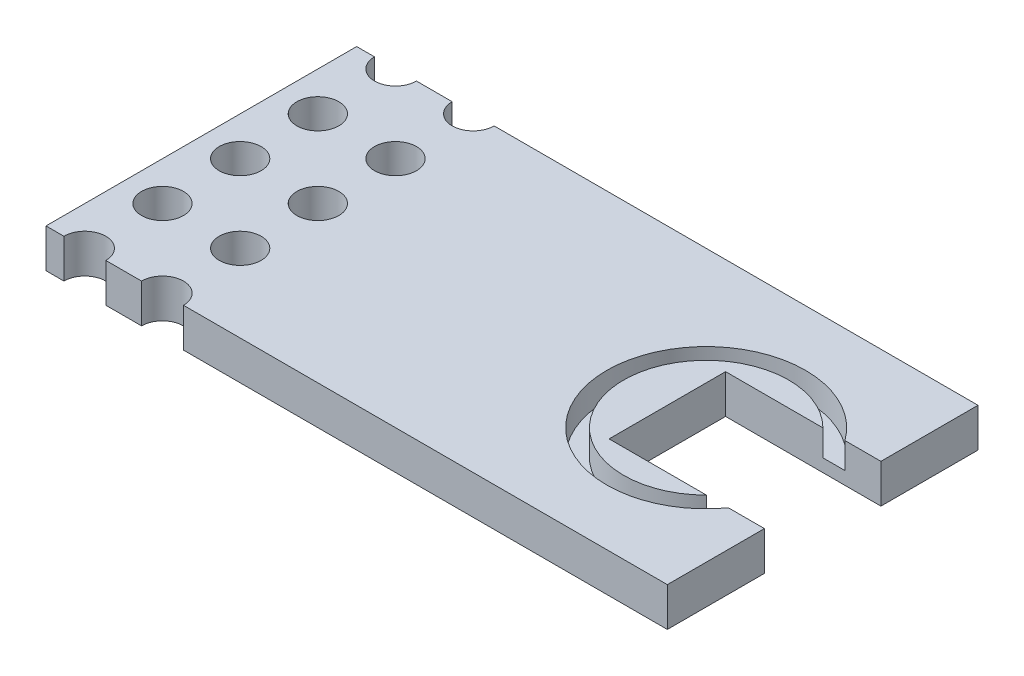
ISO-10303-21;
HEADER;
FILE_DESCRIPTION(('STEP AP214'),'2;1');
FILE_NAME('part.step','',(''),(''),'','','');
FILE_SCHEMA(('AUTOMOTIVE_DESIGN { 1 0 10303 214 1 1 1 1 }'));
ENDSEC;
DATA;
#1=APPLICATION_CONTEXT('core data for automotive mechanical design processes');
#2=APPLICATION_PROTOCOL_DEFINITION('international standard','automotive_design',2000,#1);
#3=PRODUCT_CONTEXT('',#1,'mechanical');
#4=PRODUCT('Part','Part','',(#3));
#5=PRODUCT_RELATED_PRODUCT_CATEGORY('part','',(#4));
#6=PRODUCT_DEFINITION_FORMATION('','',#4);
#7=PRODUCT_DEFINITION_CONTEXT('part definition',#1,'design');
#8=PRODUCT_DEFINITION('design','',#6,#7);
#9=PRODUCT_DEFINITION_SHAPE('','',#8);
#10=(LENGTH_UNIT() NAMED_UNIT(*) SI_UNIT(.MILLI.,.METRE.));
#11=(NAMED_UNIT(*) PLANE_ANGLE_UNIT() SI_UNIT($,.RADIAN.));
#12=(NAMED_UNIT(*) SI_UNIT($,.STERADIAN.) SOLID_ANGLE_UNIT());
#13=UNCERTAINTY_MEASURE_WITH_UNIT(LENGTH_MEASURE(1.E-05),#10,'distance_accuracy_value','');
#14=(GEOMETRIC_REPRESENTATION_CONTEXT(3) GLOBAL_UNCERTAINTY_ASSIGNED_CONTEXT((#13)) GLOBAL_UNIT_ASSIGNED_CONTEXT((#10,
#11,#12)) REPRESENTATION_CONTEXT('',''));
#15=CARTESIAN_POINT('',(0.,0.,0.));
#16=DIRECTION('',(0.,0.,1.));
#17=DIRECTION('',(1.,0.,0.));
#18=AXIS2_PLACEMENT_3D('',#15,#16,#17);
#19=CARTESIAN_POINT('',(0.,6.35,0.));
#20=DIRECTION('',(0.,-1.,0.));
#21=DIRECTION('',(0.,0.,-1.));
#22=AXIS2_PLACEMENT_3D('',#19,#20,#21);
#23=PLANE('',#22);
#24=CARTESIAN_POINT('',(-57.1499999999997,6.35,-12.7000000000001));
#25=DIRECTION('',(0.,1.,0.));
#26=DIRECTION('',(0.,0.,1.));
#27=AXIS2_PLACEMENT_3D('',#24,#25,#26);
#28=CIRCLE('',#27,3.42899999999999);
#29=CARTESIAN_POINT('',(-57.1499999999997,6.35,-9.27100000000008));
#30=VERTEX_POINT('',#29);
#31=EDGE_CURVE('E258',#30,#30,#28,.T.);
#32=ORIENTED_EDGE('',*,*,#31,.F.);
#33=EDGE_LOOP('',(#32));
#34=FACE_BOUND('',#33,.T.);
#35=CARTESIAN_POINT('',(-57.1499999999996,6.35,-1.04083408558608E-13));
#36=DIRECTION('',(0.,1.,0.));
#37=DIRECTION('',(0.,0.,1.));
#38=AXIS2_PLACEMENT_3D('',#35,#36,#37);
#39=CIRCLE('',#38,3.42899999999999);
#40=CARTESIAN_POINT('',(-57.1499999999996,6.35,3.42899999999989));
#41=VERTEX_POINT('',#40);
#42=EDGE_CURVE('E252',#41,#41,#39,.T.);
#43=ORIENTED_EDGE('',*,*,#42,.F.);
#44=EDGE_LOOP('',(#43));
#45=FACE_BOUND('',#44,.T.);
#46=CARTESIAN_POINT('',(-57.1499999999995,6.35,12.6999999999999));
#47=DIRECTION('',(0.,1.,0.));
#48=DIRECTION('',(0.,0.,1.));
#49=AXIS2_PLACEMENT_3D('',#46,#47,#48);
#50=CIRCLE('',#49,3.42899999999999);
#51=CARTESIAN_POINT('',(-57.1499999999995,6.35,16.1289999999998));
#52=VERTEX_POINT('',#51);
#53=EDGE_CURVE('E246',#52,#52,#50,.T.);
#54=ORIENTED_EDGE('',*,*,#53,.F.);
#55=EDGE_LOOP('',(#54));
#56=FACE_BOUND('',#55,.T.);
#57=CARTESIAN_POINT('',(-69.8499999999997,6.35,-12.7000000000001));
#58=DIRECTION('',(0.,1.,0.));
#59=DIRECTION('',(0.,0.,1.));
#60=AXIS2_PLACEMENT_3D('',#57,#58,#59);
#61=CIRCLE('',#60,3.42899999999998);
#62=CARTESIAN_POINT('',(-69.8499999999997,6.35,-9.27100000000009));
#63=VERTEX_POINT('',#62);
#64=EDGE_CURVE('E237',#63,#63,#61,.T.);
#65=ORIENTED_EDGE('',*,*,#64,.F.);
#66=EDGE_LOOP('',(#65));
#67=FACE_BOUND('',#66,.T.);
#68=CARTESIAN_POINT('',(-69.8499999999996,6.35,-1.04083408558608E-13));
#69=DIRECTION('',(0.,1.,0.));
#70=DIRECTION('',(0.,0.,1.));
#71=AXIS2_PLACEMENT_3D('',#68,#69,#70);
#72=CIRCLE('',#71,3.42899999999998);
#73=CARTESIAN_POINT('',(-69.8499999999996,6.35,3.42899999999988));
#74=VERTEX_POINT('',#73);
#75=EDGE_CURVE('E345',#74,#74,#72,.T.);
#76=ORIENTED_EDGE('',*,*,#75,.F.);
#77=EDGE_LOOP('',(#76));
#78=FACE_BOUND('',#77,.T.);
#79=CARTESIAN_POINT('',(-69.8499999999994,6.35,12.6999999999999));
#80=DIRECTION('',(0.,1.,0.));
#81=DIRECTION('',(0.,0.,1.));
#82=AXIS2_PLACEMENT_3D('',#79,#80,#81);
#83=CIRCLE('',#82,3.429);
#84=CARTESIAN_POINT('',(-69.8499999999994,6.35,16.1289999999999));
#85=VERTEX_POINT('',#84);
#86=EDGE_CURVE('E339',#85,#85,#83,.T.);
#87=ORIENTED_EDGE('',*,*,#86,.F.);
#88=EDGE_LOOP('',(#87));
#89=FACE_BOUND('',#88,.T.);
#90=DIRECTION('',(0.,0.,1.));
#91=VECTOR('',#90,1.);
#92=CARTESIAN_POINT('',(-76.1999999999999,6.35,44.45));
#93=LINE('',#92,#91);
#94=CARTESIAN_POINT('',(-76.1999999999999,6.35,-25.4));
#95=VERTEX_POINT('',#94);
#96=CARTESIAN_POINT('',(-76.1999999999999,6.35,25.4));
#97=VERTEX_POINT('',#96);
#98=EDGE_CURVE('E194',#95,#97,#93,.T.);
#99=ORIENTED_EDGE('',*,*,#98,.T.);
#100=DIRECTION('',(1.,0.,0.));
#101=VECTOR('',#100,1.);
#102=CARTESIAN_POINT('',(-76.1999999999999,6.35,25.4));
#103=LINE('',#102,#101);
#104=CARTESIAN_POINT('',(-73.2789999999993,6.35,25.4));
#105=VERTEX_POINT('',#104);
#106=EDGE_CURVE('E175',#97,#105,#103,.T.);
#107=ORIENTED_EDGE('',*,*,#106,.T.);
#108=CARTESIAN_POINT('',(-69.8499999999993,6.35,25.3999999999998));
#109=DIRECTION('',(0.,1.,0.));
#110=DIRECTION('',(0.,0.,1.));
#111=AXIS2_PLACEMENT_3D('',#108,#109,#110);
#112=CIRCLE('',#111,3.42899999999998);
#113=CARTESIAN_POINT('',(-66.4209999999993,6.35,25.4));
#114=VERTEX_POINT('',#113);
#115=EDGE_CURVE('E334',#114,#105,#112,.T.);
#116=ORIENTED_EDGE('',*,*,#115,.F.);
#117=CARTESIAN_POINT('',(-60.5789999999993,6.35,25.4));
#118=VERTEX_POINT('',#117);
#119=EDGE_CURVE('E187',#114,#118,#103,.T.);
#120=ORIENTED_EDGE('',*,*,#119,.T.);
#121=CARTESIAN_POINT('',(-57.1499999999993,6.35,25.3999999999998));
#122=DIRECTION('',(0.,1.,0.));
#123=DIRECTION('',(0.,0.,1.));
#124=AXIS2_PLACEMENT_3D('',#121,#122,#123);
#125=CIRCLE('',#124,3.42899999999999);
#126=CARTESIAN_POINT('',(-53.7209999999993,6.35,25.4));
#127=VERTEX_POINT('',#126);
#128=EDGE_CURVE('E235',#127,#118,#125,.T.);
#129=ORIENTED_EDGE('',*,*,#128,.F.);
#130=CARTESIAN_POINT('',(25.4,6.35,25.4));
#131=VERTEX_POINT('',#130);
#132=EDGE_CURVE('E189',#127,#131,#103,.T.);
#133=ORIENTED_EDGE('',*,*,#132,.T.);
#134=DIRECTION('',(0.,0.,-1.));
#135=VECTOR('',#134,1.);
#136=CARTESIAN_POINT('',(25.4,6.35,25.4));
#137=LINE('',#136,#135);
#138=CARTESIAN_POINT('',(25.4000000000001,6.35,9.525));
#139=VERTEX_POINT('',#138);
#140=EDGE_CURVE('E422',#131,#139,#137,.T.);
#141=ORIENTED_EDGE('',*,*,#140,.T.);
#142=DIRECTION('',(1.,0.,0.));
#143=VECTOR('',#142,1.);
#144=CARTESIAN_POINT('',(0.,6.35,9.525));
#145=LINE('',#144,#143);
#146=CARTESIAN_POINT('',(19.5157462758478,6.35,9.525));
#147=VERTEX_POINT('',#146);
#148=EDGE_CURVE('E296',#147,#139,#145,.T.);
#149=ORIENTED_EDGE('',*,*,#148,.F.);
#150=CARTESIAN_POINT('',(6.35,6.35,0.));
#151=DIRECTION('',(0.,-1.,0.));
#152=DIRECTION('',(0.,0.,-1.));
#153=AXIS2_PLACEMENT_3D('',#150,#151,#152);
#154=CIRCLE('',#153,16.25);
#155=CARTESIAN_POINT('',(19.5157462758478,6.35,-9.525));
#156=VERTEX_POINT('',#155);
#157=EDGE_CURVE('E325',#147,#156,#154,.T.);
#158=ORIENTED_EDGE('',*,*,#157,.T.);
#159=DIRECTION('',(-1.,0.,0.));
#160=VECTOR('',#159,1.);
#161=CARTESIAN_POINT('',(0.,6.35,-9.525));
#162=LINE('',#161,#160);
#163=CARTESIAN_POINT('',(25.4000000000001,6.35,-9.525));
#164=VERTEX_POINT('',#163);
#165=EDGE_CURVE('E289',#164,#156,#162,.T.);
#166=ORIENTED_EDGE('',*,*,#165,.F.);
#167=CARTESIAN_POINT('',(25.4000000000001,6.35,-25.4));
#168=VERTEX_POINT('',#167);
#169=EDGE_CURVE('E186',#164,#168,#137,.T.);
#170=ORIENTED_EDGE('',*,*,#169,.T.);
#171=DIRECTION('',(-1.,0.,0.));
#172=VECTOR('',#171,1.);
#173=CARTESIAN_POINT('',(25.4000000000001,6.35,-25.4));
#174=LINE('',#173,#172);
#175=CARTESIAN_POINT('',(-53.7209999999999,6.35,-25.4));
#176=VERTEX_POINT('',#175);
#177=EDGE_CURVE('E228',#168,#176,#174,.T.);
#178=ORIENTED_EDGE('',*,*,#177,.T.);
#179=CARTESIAN_POINT('',(-57.1499999999999,6.35,-25.4));
#180=DIRECTION('',(0.,1.,0.));
#181=DIRECTION('',(0.,0.,1.));
#182=AXIS2_PLACEMENT_3D('',#179,#180,#181);
#183=CIRCLE('',#182,3.42899999999999);
#184=CARTESIAN_POINT('',(-60.5789999999999,6.35,-25.4));
#185=VERTEX_POINT('',#184);
#186=EDGE_CURVE('E206',#185,#176,#183,.T.);
#187=ORIENTED_EDGE('',*,*,#186,.F.);
#188=CARTESIAN_POINT('',(-66.4209999999998,6.35,-25.4));
#189=VERTEX_POINT('',#188);
#190=EDGE_CURVE('E218',#185,#189,#174,.T.);
#191=ORIENTED_EDGE('',*,*,#190,.T.);
#192=CARTESIAN_POINT('',(-69.8499999999998,6.35,-25.4));
#193=DIRECTION('',(0.,1.,0.));
#194=DIRECTION('',(0.,0.,1.));
#195=AXIS2_PLACEMENT_3D('',#192,#193,#194);
#196=CIRCLE('',#195,3.42899999999998);
#197=CARTESIAN_POINT('',(-73.2789999999998,6.35,-25.4));
#198=VERTEX_POINT('',#197);
#199=EDGE_CURVE('E225',#198,#189,#196,.T.);
#200=ORIENTED_EDGE('',*,*,#199,.F.);
#201=EDGE_CURVE('E62',#198,#95,#174,.T.);
#202=ORIENTED_EDGE('',*,*,#201,.T.);
#203=EDGE_LOOP('',(#99,#107,#116,#120,#129,#133,#141,#149,#158,#166,#170,#178,#187,#191,#200,#202));
#204=FACE_BOUND('',#203,.T.);
#205=ADVANCED_FACE('F40',(#34,#45,#56,#67,#78,#89,#204),#23,.F.);
#206=CARTESIAN_POINT('',(0.,0.,0.));
#207=DIRECTION('',(0.,-1.,0.));
#208=DIRECTION('',(0.,0.,-1.));
#209=AXIS2_PLACEMENT_3D('',#206,#207,#208);
#210=PLANE('',#209);
#211=DIRECTION('',(1.,0.,0.));
#212=VECTOR('',#211,1.);
#213=CARTESIAN_POINT('',(-76.1999999999999,0.,25.4));
#214=LINE('',#213,#212);
#215=CARTESIAN_POINT('',(-76.1999999999999,0.,25.4));
#216=VERTEX_POINT('',#215);
#217=CARTESIAN_POINT('',(-73.2789999999993,0.,25.4));
#218=VERTEX_POINT('',#217);
#219=EDGE_CURVE('E429',#216,#218,#214,.T.);
#220=ORIENTED_EDGE('',*,*,#219,.F.);
#221=DIRECTION('',(0.,0.,1.));
#222=VECTOR('',#221,1.);
#223=CARTESIAN_POINT('',(-76.1999999999999,0.,44.45));
#224=LINE('',#223,#222);
#225=CARTESIAN_POINT('',(-76.1999999999999,0.,-25.4));
#226=VERTEX_POINT('',#225);
#227=EDGE_CURVE('E196',#226,#216,#224,.T.);
#228=ORIENTED_EDGE('',*,*,#227,.F.);
#229=DIRECTION('',(-1.,0.,0.));
#230=VECTOR('',#229,1.);
#231=CARTESIAN_POINT('',(25.4000000000001,0.,-25.4));
#232=LINE('',#231,#230);
#233=CARTESIAN_POINT('',(-73.2789999999998,0.,-25.4));
#234=VERTEX_POINT('',#233);
#235=EDGE_CURVE('E435',#234,#226,#232,.T.);
#236=ORIENTED_EDGE('',*,*,#235,.F.);
#237=CARTESIAN_POINT('',(-69.8499999999998,0.,-25.4));
#238=DIRECTION('',(0.,1.,0.));
#239=DIRECTION('',(0.,0.,1.));
#240=AXIS2_PLACEMENT_3D('',#237,#238,#239);
#241=CIRCLE('',#240,3.42899999999998);
#242=CARTESIAN_POINT('',(-66.4209999999998,0.,-25.4));
#243=VERTEX_POINT('',#242);
#244=EDGE_CURVE('E232',#234,#243,#241,.T.);
#245=ORIENTED_EDGE('',*,*,#244,.T.);
#246=CARTESIAN_POINT('',(-60.5789999999999,0.,-25.4));
#247=VERTEX_POINT('',#246);
#248=EDGE_CURVE('E55',#247,#243,#232,.T.);
#249=ORIENTED_EDGE('',*,*,#248,.F.);
#250=CARTESIAN_POINT('',(-57.1499999999999,0.,-25.4));
#251=DIRECTION('',(0.,1.,0.));
#252=DIRECTION('',(0.,0.,1.));
#253=AXIS2_PLACEMENT_3D('',#250,#251,#252);
#254=CIRCLE('',#253,3.42899999999999);
#255=CARTESIAN_POINT('',(-53.7209999999999,0.,-25.4));
#256=VERTEX_POINT('',#255);
#257=EDGE_CURVE('E209',#247,#256,#254,.T.);
#258=ORIENTED_EDGE('',*,*,#257,.T.);
#259=CARTESIAN_POINT('',(25.4000000000001,0.,-25.4));
#260=VERTEX_POINT('',#259);
#261=EDGE_CURVE('E271',#260,#256,#232,.T.);
#262=ORIENTED_EDGE('',*,*,#261,.F.);
#263=DIRECTION('',(0.,0.,-1.));
#264=VECTOR('',#263,1.);
#265=CARTESIAN_POINT('',(25.4,0.,25.4));
#266=LINE('',#265,#264);
#267=CARTESIAN_POINT('',(25.4000000000001,0.,-9.525));
#268=VERTEX_POINT('',#267);
#269=EDGE_CURVE('E405',#268,#260,#266,.T.);
#270=ORIENTED_EDGE('',*,*,#269,.F.);
#271=DIRECTION('',(-1.,0.,0.));
#272=VECTOR('',#271,1.);
#273=CARTESIAN_POINT('',(0.,0.,-9.525));
#274=LINE('',#273,#272);
#275=CARTESIAN_POINT('',(0.,0.,-9.525));
#276=VERTEX_POINT('',#275);
#277=EDGE_CURVE('E292',#268,#276,#274,.T.);
#278=ORIENTED_EDGE('',*,*,#277,.T.);
#279=DIRECTION('',(0.,0.,1.));
#280=VECTOR('',#279,1.);
#281=CARTESIAN_POINT('',(0.,0.,-9.525));
#282=LINE('',#281,#280);
#283=CARTESIAN_POINT('',(0.,0.,9.525));
#284=VERTEX_POINT('',#283);
#285=EDGE_CURVE('E285',#276,#284,#282,.T.);
#286=ORIENTED_EDGE('',*,*,#285,.T.);
#287=DIRECTION('',(1.,0.,0.));
#288=VECTOR('',#287,1.);
#289=CARTESIAN_POINT('',(0.,0.,9.525));
#290=LINE('',#289,#288);
#291=CARTESIAN_POINT('',(25.4000000000001,0.,9.525));
#292=VERTEX_POINT('',#291);
#293=EDGE_CURVE('E288',#284,#292,#290,.T.);
#294=ORIENTED_EDGE('',*,*,#293,.T.);
#295=CARTESIAN_POINT('',(25.4,0.,25.4));
#296=VERTEX_POINT('',#295);
#297=EDGE_CURVE('E433',#296,#292,#266,.T.);
#298=ORIENTED_EDGE('',*,*,#297,.F.);
#299=CARTESIAN_POINT('',(-53.7209999999993,0.,25.4));
#300=VERTEX_POINT('',#299);
#301=EDGE_CURVE('E432',#300,#296,#214,.T.);
#302=ORIENTED_EDGE('',*,*,#301,.F.);
#303=CARTESIAN_POINT('',(-57.1499999999993,0.,25.3999999999998));
#304=DIRECTION('',(0.,1.,0.));
#305=DIRECTION('',(0.,0.,1.));
#306=AXIS2_PLACEMENT_3D('',#303,#304,#305);
#307=CIRCLE('',#306,3.42899999999999);
#308=CARTESIAN_POINT('',(-60.5789999999993,0.,25.4));
#309=VERTEX_POINT('',#308);
#310=EDGE_CURVE('E231',#300,#309,#307,.T.);
#311=ORIENTED_EDGE('',*,*,#310,.T.);
#312=CARTESIAN_POINT('',(-66.4209999999993,0.,25.4));
#313=VERTEX_POINT('',#312);
#314=EDGE_CURVE('E431',#313,#309,#214,.T.);
#315=ORIENTED_EDGE('',*,*,#314,.F.);
#316=CARTESIAN_POINT('',(-69.8499999999993,0.,25.3999999999998));
#317=DIRECTION('',(0.,1.,0.));
#318=DIRECTION('',(0.,0.,1.));
#319=AXIS2_PLACEMENT_3D('',#316,#317,#318);
#320=CIRCLE('',#319,3.42899999999998);
#321=EDGE_CURVE('E331',#313,#218,#320,.T.);
#322=ORIENTED_EDGE('',*,*,#321,.T.);
#323=EDGE_LOOP('',(#220,#228,#236,#245,#249,#258,#262,#270,#278,#286,#294,#298,#302,#311,#315,#322));
#324=FACE_BOUND('',#323,.T.);
#325=CARTESIAN_POINT('',(-69.8499999999996,0.,-1.04083408558608E-13));
#326=DIRECTION('',(0.,1.,0.));
#327=DIRECTION('',(0.,0.,1.));
#328=AXIS2_PLACEMENT_3D('',#325,#326,#327);
#329=CIRCLE('',#328,3.42899999999998);
#330=CARTESIAN_POINT('',(-69.8499999999996,0.,3.42899999999988));
#331=VERTEX_POINT('',#330);
#332=EDGE_CURVE('E342',#331,#331,#329,.T.);
#333=ORIENTED_EDGE('',*,*,#332,.T.);
#334=EDGE_LOOP('',(#333));
#335=FACE_BOUND('',#334,.T.);
#336=CARTESIAN_POINT('',(-57.1499999999996,0.,-1.04083408558608E-13));
#337=DIRECTION('',(0.,1.,0.));
#338=DIRECTION('',(0.,0.,1.));
#339=AXIS2_PLACEMENT_3D('',#336,#337,#338);
#340=CIRCLE('',#339,3.42899999999999);
#341=CARTESIAN_POINT('',(-57.1499999999996,0.,3.42899999999989));
#342=VERTEX_POINT('',#341);
#343=EDGE_CURVE('E249',#342,#342,#340,.T.);
#344=ORIENTED_EDGE('',*,*,#343,.T.);
#345=EDGE_LOOP('',(#344));
#346=FACE_BOUND('',#345,.T.);
#347=CARTESIAN_POINT('',(-57.1499999999997,0.,-12.7000000000001));
#348=DIRECTION('',(0.,1.,0.));
#349=DIRECTION('',(0.,0.,1.));
#350=AXIS2_PLACEMENT_3D('',#347,#348,#349);
#351=CIRCLE('',#350,3.42899999999999);
#352=CARTESIAN_POINT('',(-57.1499999999997,0.,-9.27100000000008));
#353=VERTEX_POINT('',#352);
#354=EDGE_CURVE('E255',#353,#353,#351,.T.);
#355=ORIENTED_EDGE('',*,*,#354,.T.);
#356=EDGE_LOOP('',(#355));
#357=FACE_BOUND('',#356,.T.);
#358=CARTESIAN_POINT('',(-57.1499999999995,0.,12.6999999999999));
#359=DIRECTION('',(0.,1.,0.));
#360=DIRECTION('',(0.,0.,1.));
#361=AXIS2_PLACEMENT_3D('',#358,#359,#360);
#362=CIRCLE('',#361,3.42899999999999);
#363=CARTESIAN_POINT('',(-57.1499999999995,0.,16.1289999999998));
#364=VERTEX_POINT('',#363);
#365=EDGE_CURVE('E244',#364,#364,#362,.T.);
#366=ORIENTED_EDGE('',*,*,#365,.T.);
#367=EDGE_LOOP('',(#366));
#368=FACE_BOUND('',#367,.T.);
#369=CARTESIAN_POINT('',(-69.8499999999997,0.,-12.7000000000001));
#370=DIRECTION('',(0.,1.,0.));
#371=DIRECTION('',(0.,0.,1.));
#372=AXIS2_PLACEMENT_3D('',#369,#370,#371);
#373=CIRCLE('',#372,3.42899999999998);
#374=CARTESIAN_POINT('',(-69.8499999999997,0.,-9.27100000000009));
#375=VERTEX_POINT('',#374);
#376=EDGE_CURVE('E240',#375,#375,#373,.T.);
#377=ORIENTED_EDGE('',*,*,#376,.T.);
#378=EDGE_LOOP('',(#377));
#379=FACE_BOUND('',#378,.T.);
#380=CARTESIAN_POINT('',(-69.8499999999994,0.,12.6999999999999));
#381=DIRECTION('',(0.,1.,0.));
#382=DIRECTION('',(0.,0.,1.));
#383=AXIS2_PLACEMENT_3D('',#380,#381,#382);
#384=CIRCLE('',#383,3.429);
#385=CARTESIAN_POINT('',(-69.8499999999994,0.,16.1289999999999));
#386=VERTEX_POINT('',#385);
#387=EDGE_CURVE('E336',#386,#386,#384,.T.);
#388=ORIENTED_EDGE('',*,*,#387,.T.);
#389=EDGE_LOOP('',(#388));
#390=FACE_BOUND('',#389,.T.);
#391=ADVANCED_FACE('F268',(#324,#335,#346,#357,#368,#379,#390),#210,.T.);
#392=CARTESIAN_POINT('',(-76.1999999999999,6.35,44.45));
#393=DIRECTION('',(1.,0.,0.));
#394=DIRECTION('',(0.,0.,-1.));
#395=AXIS2_PLACEMENT_3D('',#392,#393,#394);
#396=PLANE('',#395);
#397=ORIENTED_EDGE('',*,*,#227,.T.);
#398=DIRECTION('',(0.,-1.,0.));
#399=VECTOR('',#398,1.);
#400=CARTESIAN_POINT('',(-76.1999999999999,6.35,25.4));
#401=LINE('',#400,#399);
#402=EDGE_CURVE('E178',#97,#216,#401,.T.);
#403=ORIENTED_EDGE('',*,*,#402,.F.);
#404=ORIENTED_EDGE('',*,*,#98,.F.);
#405=DIRECTION('',(0.,-1.,0.));
#406=VECTOR('',#405,1.);
#407=CARTESIAN_POINT('',(-76.1999999999999,6.35,-25.4));
#408=LINE('',#407,#406);
#409=EDGE_CURVE('E428',#95,#226,#408,.T.);
#410=ORIENTED_EDGE('',*,*,#409,.T.);
#411=EDGE_LOOP('',(#397,#403,#404,#410));
#412=FACE_BOUND('',#411,.T.);
#413=ADVANCED_FACE('F42',(#412),#396,.F.);
#414=CARTESIAN_POINT('',(-57.1499999999999,6.35,-25.4));
#415=DIRECTION('',(0.,-1.,0.));
#416=DIRECTION('',(0.,0.,-1.));
#417=AXIS2_PLACEMENT_3D('',#414,#415,#416);
#418=CYLINDRICAL_SURFACE('',#417,3.42899999999999);
#419=DIRECTION('',(0.,-1.,0.));
#420=VECTOR('',#419,1.);
#421=CARTESIAN_POINT('',(-60.5789999999999,6.35,-25.4));
#422=LINE('',#421,#420);
#423=EDGE_CURVE('E273',#185,#247,#422,.T.);
#424=ORIENTED_EDGE('',*,*,#423,.F.);
#425=ORIENTED_EDGE('',*,*,#186,.T.);
#426=DIRECTION('',(0.,-1.,0.));
#427=VECTOR('',#426,1.);
#428=CARTESIAN_POINT('',(-53.7209999999999,6.35,-25.4));
#429=LINE('',#428,#427);
#430=EDGE_CURVE('E274',#256,#176,#429,.F.);
#431=ORIENTED_EDGE('',*,*,#430,.F.);
#432=ORIENTED_EDGE('',*,*,#257,.F.);
#433=EDGE_LOOP('',(#424,#425,#431,#432));
#434=FACE_BOUND('',#433,.T.);
#435=ADVANCED_FACE('F272',(#434),#418,.F.);
#436=CARTESIAN_POINT('',(-57.1499999999997,6.35,-12.7000000000001));
#437=DIRECTION('',(0.,-1.,0.));
#438=DIRECTION('',(0.,0.,-1.));
#439=AXIS2_PLACEMENT_3D('',#436,#437,#438);
#440=CYLINDRICAL_SURFACE('',#439,3.42899999999999);
#441=ORIENTED_EDGE('',*,*,#31,.T.);
#442=EDGE_LOOP('',(#441));
#443=FACE_BOUND('',#442,.T.);
#444=ORIENTED_EDGE('',*,*,#354,.F.);
#445=EDGE_LOOP('',(#444));
#446=FACE_BOUND('',#445,.T.);
#447=ADVANCED_FACE('F621',(#443,#446),#440,.F.);
#448=CARTESIAN_POINT('',(-57.1499999999996,6.35,-1.04083408558608E-13));
#449=DIRECTION('',(0.,-1.,0.));
#450=DIRECTION('',(0.,0.,-1.));
#451=AXIS2_PLACEMENT_3D('',#448,#449,#450);
#452=CYLINDRICAL_SURFACE('',#451,3.42899999999999);
#453=ORIENTED_EDGE('',*,*,#42,.T.);
#454=EDGE_LOOP('',(#453));
#455=FACE_BOUND('',#454,.T.);
#456=ORIENTED_EDGE('',*,*,#343,.F.);
#457=EDGE_LOOP('',(#456));
#458=FACE_BOUND('',#457,.T.);
#459=ADVANCED_FACE('F612',(#455,#458),#452,.F.);
#460=CARTESIAN_POINT('',(-57.1499999999995,6.35,12.6999999999999));
#461=DIRECTION('',(0.,-1.,0.));
#462=DIRECTION('',(0.,0.,-1.));
#463=AXIS2_PLACEMENT_3D('',#460,#461,#462);
#464=CYLINDRICAL_SURFACE('',#463,3.42899999999999);
#465=ORIENTED_EDGE('',*,*,#53,.T.);
#466=EDGE_LOOP('',(#465));
#467=FACE_BOUND('',#466,.T.);
#468=ORIENTED_EDGE('',*,*,#365,.F.);
#469=EDGE_LOOP('',(#468));
#470=FACE_BOUND('',#469,.T.);
#471=ADVANCED_FACE('F604',(#467,#470),#464,.F.);
#472=CARTESIAN_POINT('',(-57.1499999999993,6.35,25.3999999999998));
#473=DIRECTION('',(0.,-1.,0.));
#474=DIRECTION('',(0.,0.,-1.));
#475=AXIS2_PLACEMENT_3D('',#472,#473,#474);
#476=CYLINDRICAL_SURFACE('',#475,3.42899999999999);
#477=DIRECTION('',(0.,-1.,0.));
#478=VECTOR('',#477,1.);
#479=CARTESIAN_POINT('',(-53.7209999999993,6.35,25.4));
#480=LINE('',#479,#478);
#481=EDGE_CURVE('E277',#127,#300,#480,.T.);
#482=ORIENTED_EDGE('',*,*,#481,.F.);
#483=ORIENTED_EDGE('',*,*,#128,.T.);
#484=DIRECTION('',(0.,-1.,0.));
#485=VECTOR('',#484,1.);
#486=CARTESIAN_POINT('',(-60.5789999999993,6.35,25.4));
#487=LINE('',#486,#485);
#488=EDGE_CURVE('E281',#309,#118,#487,.F.);
#489=ORIENTED_EDGE('',*,*,#488,.F.);
#490=ORIENTED_EDGE('',*,*,#310,.F.);
#491=EDGE_LOOP('',(#482,#483,#489,#490));
#492=FACE_BOUND('',#491,.T.);
#493=ADVANCED_FACE('F368',(#492),#476,.F.);
#494=CARTESIAN_POINT('',(-69.8499999999998,6.35,-25.4));
#495=DIRECTION('',(0.,-1.,0.));
#496=DIRECTION('',(0.,0.,-1.));
#497=AXIS2_PLACEMENT_3D('',#494,#495,#496);
#498=CYLINDRICAL_SURFACE('',#497,3.42899999999998);
#499=DIRECTION('',(0.,-1.,0.));
#500=VECTOR('',#499,1.);
#501=CARTESIAN_POINT('',(-73.2789999999998,6.35,-25.4));
#502=LINE('',#501,#500);
#503=EDGE_CURVE('E13',#198,#234,#502,.T.);
#504=ORIENTED_EDGE('',*,*,#503,.F.);
#505=ORIENTED_EDGE('',*,*,#199,.T.);
#506=DIRECTION('',(0.,-1.,0.));
#507=VECTOR('',#506,1.);
#508=CARTESIAN_POINT('',(-66.4209999999998,6.35,-25.4));
#509=LINE('',#508,#507);
#510=EDGE_CURVE('E48',#243,#189,#509,.F.);
#511=ORIENTED_EDGE('',*,*,#510,.F.);
#512=ORIENTED_EDGE('',*,*,#244,.F.);
#513=EDGE_LOOP('',(#504,#505,#511,#512));
#514=FACE_BOUND('',#513,.T.);
#515=ADVANCED_FACE('F230',(#514),#498,.F.);
#516=CARTESIAN_POINT('',(-69.8499999999997,6.35,-12.7000000000001));
#517=DIRECTION('',(0.,-1.,0.));
#518=DIRECTION('',(0.,0.,-1.));
#519=AXIS2_PLACEMENT_3D('',#516,#517,#518);
#520=CYLINDRICAL_SURFACE('',#519,3.42899999999998);
#521=ORIENTED_EDGE('',*,*,#64,.T.);
#522=EDGE_LOOP('',(#521));
#523=FACE_BOUND('',#522,.T.);
#524=ORIENTED_EDGE('',*,*,#376,.F.);
#525=EDGE_LOOP('',(#524));
#526=FACE_BOUND('',#525,.T.);
#527=ADVANCED_FACE('F357',(#523,#526),#520,.F.);
#528=CARTESIAN_POINT('',(-69.8499999999996,6.35,-1.04083408558608E-13));
#529=DIRECTION('',(0.,-1.,0.));
#530=DIRECTION('',(0.,0.,-1.));
#531=AXIS2_PLACEMENT_3D('',#528,#529,#530);
#532=CYLINDRICAL_SURFACE('',#531,3.42899999999998);
#533=ORIENTED_EDGE('',*,*,#75,.T.);
#534=EDGE_LOOP('',(#533));
#535=FACE_BOUND('',#534,.T.);
#536=ORIENTED_EDGE('',*,*,#332,.F.);
#537=EDGE_LOOP('',(#536));
#538=FACE_BOUND('',#537,.T.);
#539=ADVANCED_FACE('F359',(#535,#538),#532,.F.);
#540=CARTESIAN_POINT('',(-69.8499999999994,6.35,12.6999999999999));
#541=DIRECTION('',(0.,-1.,0.));
#542=DIRECTION('',(0.,0.,-1.));
#543=AXIS2_PLACEMENT_3D('',#540,#541,#542);
#544=CYLINDRICAL_SURFACE('',#543,3.429);
#545=ORIENTED_EDGE('',*,*,#86,.T.);
#546=EDGE_LOOP('',(#545));
#547=FACE_BOUND('',#546,.T.);
#548=ORIENTED_EDGE('',*,*,#387,.F.);
#549=EDGE_LOOP('',(#548));
#550=FACE_BOUND('',#549,.T.);
#551=ADVANCED_FACE('F365',(#547,#550),#544,.F.);
#552=CARTESIAN_POINT('',(-69.8499999999993,6.35,25.3999999999998));
#553=DIRECTION('',(0.,-1.,0.));
#554=DIRECTION('',(0.,0.,-1.));
#555=AXIS2_PLACEMENT_3D('',#552,#553,#554);
#556=CYLINDRICAL_SURFACE('',#555,3.42899999999998);
#557=DIRECTION('',(0.,-1.,0.));
#558=VECTOR('',#557,1.);
#559=CARTESIAN_POINT('',(-66.4209999999993,6.35,25.4));
#560=LINE('',#559,#558);
#561=EDGE_CURVE('E215',#114,#313,#560,.T.);
#562=ORIENTED_EDGE('',*,*,#561,.F.);
#563=ORIENTED_EDGE('',*,*,#115,.T.);
#564=DIRECTION('',(0.,-1.,0.));
#565=VECTOR('',#564,1.);
#566=CARTESIAN_POINT('',(-73.2789999999993,6.35,25.4));
#567=LINE('',#566,#565);
#568=EDGE_CURVE('E181',#218,#105,#567,.F.);
#569=ORIENTED_EDGE('',*,*,#568,.F.);
#570=ORIENTED_EDGE('',*,*,#321,.F.);
#571=EDGE_LOOP('',(#562,#563,#569,#570));
#572=FACE_BOUND('',#571,.T.);
#573=ADVANCED_FACE('F482',(#572),#556,.F.);
#574=CARTESIAN_POINT('',(6.35,2.1,0.));
#575=DIRECTION('',(0.,-1.,0.));
#576=DIRECTION('',(0.,0.,-1.));
#577=AXIS2_PLACEMENT_3D('',#574,#575,#576);
#578=PLANE('',#577);
#579=CARTESIAN_POINT('',(6.35,2.1,0.));
#580=DIRECTION('',(0.,-1.,0.));
#581=DIRECTION('',(0.,0.,-1.));
#582=AXIS2_PLACEMENT_3D('',#579,#580,#581);
#583=CIRCLE('',#582,13.5);
#584=CARTESIAN_POINT('',(15.9168372516731,2.1,9.525));
#585=VERTEX_POINT('',#584);
#586=CARTESIAN_POINT('',(15.9168372516731,2.1,-9.525));
#587=VERTEX_POINT('',#586);
#588=EDGE_CURVE('E322',#585,#587,#583,.T.);
#589=ORIENTED_EDGE('',*,*,#588,.T.);
#590=DIRECTION('',(1.,0.,0.));
#591=VECTOR('',#590,1.);
#592=CARTESIAN_POINT('',(6.35,2.1,-9.525));
#593=LINE('',#592,#591);
#594=CARTESIAN_POINT('',(19.5157462758478,2.1,-9.525));
#595=VERTEX_POINT('',#594);
#596=EDGE_CURVE('E316',#587,#595,#593,.T.);
#597=ORIENTED_EDGE('',*,*,#596,.T.);
#598=CARTESIAN_POINT('',(6.35,2.1,0.));
#599=DIRECTION('',(0.,-1.,0.));
#600=DIRECTION('',(0.,0.,-1.));
#601=AXIS2_PLACEMENT_3D('',#598,#599,#600);
#602=CIRCLE('',#601,16.25);
#603=CARTESIAN_POINT('',(19.5157462758478,2.1,9.525));
#604=VERTEX_POINT('',#603);
#605=EDGE_CURVE('E328',#604,#595,#602,.T.);
#606=ORIENTED_EDGE('',*,*,#605,.F.);
#607=DIRECTION('',(-1.,0.,0.));
#608=VECTOR('',#607,1.);
#609=CARTESIAN_POINT('',(6.35,2.1,9.525));
#610=LINE('',#609,#608);
#611=EDGE_CURVE('E308',#604,#585,#610,.T.);
#612=ORIENTED_EDGE('',*,*,#611,.T.);
#613=EDGE_LOOP('',(#589,#597,#606,#612));
#614=FACE_BOUND('',#613,.T.);
#615=ADVANCED_FACE('F410',(#614),#578,.F.);
#616=CARTESIAN_POINT('',(6.35,2.1,0.));
#617=DIRECTION('',(0.,1.,0.));
#618=DIRECTION('',(0.,0.,1.));
#619=AXIS2_PLACEMENT_3D('',#616,#617,#618);
#620=CYLINDRICAL_SURFACE('',#619,16.25);
#621=DIRECTION('',(0.,1.,0.));
#622=VECTOR('',#621,1.);
#623=CARTESIAN_POINT('',(19.5157462758478,2.1,-9.525));
#624=LINE('',#623,#622);
#625=EDGE_CURVE('E319',#156,#595,#624,.F.);
#626=ORIENTED_EDGE('',*,*,#625,.F.);
#627=ORIENTED_EDGE('',*,*,#157,.F.);
#628=DIRECTION('',(0.,1.,0.));
#629=VECTOR('',#628,1.);
#630=CARTESIAN_POINT('',(19.5157462758478,2.1,9.525));
#631=LINE('',#630,#629);
#632=EDGE_CURVE('E311',#604,#147,#631,.T.);
#633=ORIENTED_EDGE('',*,*,#632,.F.);
#634=ORIENTED_EDGE('',*,*,#605,.T.);
#635=EDGE_LOOP('',(#626,#627,#633,#634));
#636=FACE_BOUND('',#635,.T.);
#637=ADVANCED_FACE('F391',(#636),#620,.F.);
#638=CARTESIAN_POINT('',(6.35,2.1,0.));
#639=DIRECTION('',(0.,1.,0.));
#640=DIRECTION('',(0.,0.,1.));
#641=AXIS2_PLACEMENT_3D('',#638,#639,#640);
#642=CYLINDRICAL_SURFACE('',#641,13.5);
#643=CARTESIAN_POINT('',(6.35,6.35,0.));
#644=DIRECTION('',(0.,-1.,0.));
#645=DIRECTION('',(0.,0.,-1.));
#646=AXIS2_PLACEMENT_3D('',#643,#644,#645);
#647=CIRCLE('',#646,13.5);
#648=CARTESIAN_POINT('',(15.9168372516731,6.35,9.525));
#649=VERTEX_POINT('',#648);
#650=CARTESIAN_POINT('',(15.9168372516731,6.35,-9.525));
#651=VERTEX_POINT('',#650);
#652=EDGE_CURVE('E321',#649,#651,#647,.T.);
#653=ORIENTED_EDGE('',*,*,#652,.T.);
#654=DIRECTION('',(0.,1.,0.));
#655=VECTOR('',#654,1.);
#656=CARTESIAN_POINT('',(15.9168372516731,2.1,-9.525));
#657=LINE('',#656,#655);
#658=EDGE_CURVE('E313',#651,#587,#657,.F.);
#659=ORIENTED_EDGE('',*,*,#658,.T.);
#660=ORIENTED_EDGE('',*,*,#588,.F.);
#661=DIRECTION('',(0.,1.,0.));
#662=VECTOR('',#661,1.);
#663=CARTESIAN_POINT('',(15.9168372516731,2.1,9.525));
#664=LINE('',#663,#662);
#665=EDGE_CURVE('E303',#585,#649,#664,.T.);
#666=ORIENTED_EDGE('',*,*,#665,.T.);
#667=EDGE_LOOP('',(#653,#659,#660,#666));
#668=FACE_BOUND('',#667,.T.);
#669=ADVANCED_FACE('F382',(#668),#642,.T.);
#670=DIRECTION('',(0.,0.,1.));
#671=VECTOR('',#670,1.);
#672=CARTESIAN_POINT('',(0.,6.35,-9.525));
#673=LINE('',#672,#671);
#674=CARTESIAN_POINT('',(0.,6.35,-9.525));
#675=VERTEX_POINT('',#674);
#676=CARTESIAN_POINT('',(0.,6.35,9.525));
#677=VERTEX_POINT('',#676);
#678=EDGE_CURVE('E279',#675,#677,#673,.T.);
#679=ORIENTED_EDGE('',*,*,#678,.F.);
#680=DIRECTION('',(1.,0.,0.));
#681=VECTOR('',#680,1.);
#682=CARTESIAN_POINT('',(0.,6.35,-9.525));
#683=LINE('',#682,#681);
#684=EDGE_CURVE('E201',#675,#651,#683,.T.);
#685=ORIENTED_EDGE('',*,*,#684,.T.);
#686=ORIENTED_EDGE('',*,*,#652,.F.);
#687=EDGE_CURVE('E297',#677,#649,#145,.T.);
#688=ORIENTED_EDGE('',*,*,#687,.F.);
#689=EDGE_LOOP('',(#679,#685,#686,#688));
#690=FACE_BOUND('',#689,.T.);
#691=ADVANCED_FACE('F373',(#690),#23,.F.);
#692=CARTESIAN_POINT('',(0.,0.,-9.525));
#693=DIRECTION('',(-1.,0.,0.));
#694=DIRECTION('',(0.,0.,1.));
#695=AXIS2_PLACEMENT_3D('',#692,#693,#694);
#696=PLANE('',#695);
#697=ORIENTED_EDGE('',*,*,#678,.T.);
#698=DIRECTION('',(0.,1.,0.));
#699=VECTOR('',#698,1.);
#700=CARTESIAN_POINT('',(0.,0.,9.525));
#701=LINE('',#700,#699);
#702=EDGE_CURVE('E294',#284,#677,#701,.T.);
#703=ORIENTED_EDGE('',*,*,#702,.F.);
#704=ORIENTED_EDGE('',*,*,#285,.F.);
#705=DIRECTION('',(0.,1.,0.));
#706=VECTOR('',#705,1.);
#707=CARTESIAN_POINT('',(0.,0.,-9.525));
#708=LINE('',#707,#706);
#709=EDGE_CURVE('E300',#276,#675,#708,.T.);
#710=ORIENTED_EDGE('',*,*,#709,.T.);
#711=EDGE_LOOP('',(#697,#703,#704,#710));
#712=FACE_BOUND('',#711,.T.);
#713=ADVANCED_FACE('F381',(#712),#696,.F.);
#714=CARTESIAN_POINT('',(0.,0.,-9.525));
#715=DIRECTION('',(0.,0.,-1.));
#716=DIRECTION('',(-1.,0.,0.));
#717=AXIS2_PLACEMENT_3D('',#714,#715,#716);
#718=PLANE('',#717);
#719=ORIENTED_EDGE('',*,*,#277,.F.);
#720=DIRECTION('',(0.,1.,0.));
#721=VECTOR('',#720,1.);
#722=CARTESIAN_POINT('',(25.4000000000001,0.,-9.525));
#723=LINE('',#722,#721);
#724=EDGE_CURVE('E197',#268,#164,#723,.T.);
#725=ORIENTED_EDGE('',*,*,#724,.T.);
#726=ORIENTED_EDGE('',*,*,#165,.T.);
#727=ORIENTED_EDGE('',*,*,#625,.T.);
#728=ORIENTED_EDGE('',*,*,#596,.F.);
#729=ORIENTED_EDGE('',*,*,#658,.F.);
#730=ORIENTED_EDGE('',*,*,#684,.F.);
#731=ORIENTED_EDGE('',*,*,#709,.F.);
#732=EDGE_LOOP('',(#719,#725,#726,#727,#728,#729,#730,#731));
#733=FACE_BOUND('',#732,.T.);
#734=ADVANCED_FACE('F388',(#733),#718,.F.);
#735=CARTESIAN_POINT('',(0.,0.,9.525));
#736=DIRECTION('',(0.,0.,1.));
#737=DIRECTION('',(1.,0.,0.));
#738=AXIS2_PLACEMENT_3D('',#735,#736,#737);
#739=PLANE('',#738);
#740=ORIENTED_EDGE('',*,*,#148,.T.);
#741=DIRECTION('',(0.,-1.,0.));
#742=VECTOR('',#741,1.);
#743=CARTESIAN_POINT('',(25.4000000000001,0.,9.525));
#744=LINE('',#743,#742);
#745=EDGE_CURVE('E204',#139,#292,#744,.T.);
#746=ORIENTED_EDGE('',*,*,#745,.T.);
#747=ORIENTED_EDGE('',*,*,#293,.F.);
#748=ORIENTED_EDGE('',*,*,#702,.T.);
#749=ORIENTED_EDGE('',*,*,#687,.T.);
#750=ORIENTED_EDGE('',*,*,#665,.F.);
#751=ORIENTED_EDGE('',*,*,#611,.F.);
#752=ORIENTED_EDGE('',*,*,#632,.T.);
#753=EDGE_LOOP('',(#740,#746,#747,#748,#749,#750,#751,#752));
#754=FACE_BOUND('',#753,.T.);
#755=ADVANCED_FACE('F402',(#754),#739,.F.);
#756=CARTESIAN_POINT('',(25.4,6.35,25.4));
#757=DIRECTION('',(-1.,0.,0.));
#758=DIRECTION('',(0.,0.,1.));
#759=AXIS2_PLACEMENT_3D('',#756,#757,#758);
#760=PLANE('',#759);
#761=ORIENTED_EDGE('',*,*,#140,.F.);
#762=DIRECTION('',(0.,-1.,0.));
#763=VECTOR('',#762,1.);
#764=CARTESIAN_POINT('',(25.4,6.35,25.4));
#765=LINE('',#764,#763);
#766=EDGE_CURVE('E198',#131,#296,#765,.T.);
#767=ORIENTED_EDGE('',*,*,#766,.T.);
#768=ORIENTED_EDGE('',*,*,#297,.T.);
#769=ORIENTED_EDGE('',*,*,#745,.F.);
#770=EDGE_LOOP('',(#761,#767,#768,#769));
#771=FACE_BOUND('',#770,.T.);
#772=ADVANCED_FACE('F454',(#771),#760,.F.);
#773=CARTESIAN_POINT('',(-76.1999999999999,6.35,25.4));
#774=DIRECTION('',(0.,0.,-1.));
#775=DIRECTION('',(-1.,0.,0.));
#776=AXIS2_PLACEMENT_3D('',#773,#774,#775);
#777=PLANE('',#776);
#778=ORIENTED_EDGE('',*,*,#481,.T.);
#779=ORIENTED_EDGE('',*,*,#301,.T.);
#780=ORIENTED_EDGE('',*,*,#766,.F.);
#781=ORIENTED_EDGE('',*,*,#132,.F.);
#782=EDGE_LOOP('',(#778,#779,#780,#781));
#783=FACE_BOUND('',#782,.T.);
#784=ADVANCED_FACE('F453',(#783),#777,.F.);
#785=ORIENTED_EDGE('',*,*,#269,.T.);
#786=DIRECTION('',(0.,-1.,0.));
#787=VECTOR('',#786,1.);
#788=CARTESIAN_POINT('',(25.4000000000001,6.35,-25.4));
#789=LINE('',#788,#787);
#790=EDGE_CURVE('E438',#168,#260,#789,.T.);
#791=ORIENTED_EDGE('',*,*,#790,.F.);
#792=ORIENTED_EDGE('',*,*,#169,.F.);
#793=ORIENTED_EDGE('',*,*,#724,.F.);
#794=EDGE_LOOP('',(#785,#791,#792,#793));
#795=FACE_BOUND('',#794,.T.);
#796=ADVANCED_FACE('F457',(#795),#760,.F.);
#797=CARTESIAN_POINT('',(25.4000000000001,6.35,-25.4));
#798=DIRECTION('',(0.,0.,1.));
#799=DIRECTION('',(1.,0.,0.));
#800=AXIS2_PLACEMENT_3D('',#797,#798,#799);
#801=PLANE('',#800);
#802=ORIENTED_EDGE('',*,*,#430,.T.);
#803=ORIENTED_EDGE('',*,*,#177,.F.);
#804=ORIENTED_EDGE('',*,*,#790,.T.);
#805=ORIENTED_EDGE('',*,*,#261,.T.);
#806=EDGE_LOOP('',(#802,#803,#804,#805));
#807=FACE_BOUND('',#806,.T.);
#808=ADVANCED_FACE('F466',(#807),#801,.F.);
#809=ORIENTED_EDGE('',*,*,#568,.T.);
#810=ORIENTED_EDGE('',*,*,#106,.F.);
#811=ORIENTED_EDGE('',*,*,#402,.T.);
#812=ORIENTED_EDGE('',*,*,#219,.T.);
#813=EDGE_LOOP('',(#809,#810,#811,#812));
#814=FACE_BOUND('',#813,.T.);
#815=ADVANCED_FACE('F177',(#814),#777,.F.);
#816=ORIENTED_EDGE('',*,*,#488,.T.);
#817=ORIENTED_EDGE('',*,*,#119,.F.);
#818=ORIENTED_EDGE('',*,*,#561,.T.);
#819=ORIENTED_EDGE('',*,*,#314,.T.);
#820=EDGE_LOOP('',(#816,#817,#818,#819));
#821=FACE_BOUND('',#820,.T.);
#822=ADVANCED_FACE('F445',(#821),#777,.F.);
#823=ORIENTED_EDGE('',*,*,#423,.T.);
#824=ORIENTED_EDGE('',*,*,#248,.T.);
#825=ORIENTED_EDGE('',*,*,#510,.T.);
#826=ORIENTED_EDGE('',*,*,#190,.F.);
#827=EDGE_LOOP('',(#823,#824,#825,#826));
#828=FACE_BOUND('',#827,.T.);
#829=ADVANCED_FACE('F217',(#828),#801,.F.);
#830=ORIENTED_EDGE('',*,*,#503,.T.);
#831=ORIENTED_EDGE('',*,*,#235,.T.);
#832=ORIENTED_EDGE('',*,*,#409,.F.);
#833=ORIENTED_EDGE('',*,*,#201,.F.);
#834=EDGE_LOOP('',(#830,#831,#832,#833));
#835=FACE_BOUND('',#834,.T.);
#836=ADVANCED_FACE('F471',(#835),#801,.F.);
#837=CLOSED_SHELL('',(#205,#391,#413,#435,#447,#459,#471,#493,#515,#527,#539,#551,#573,#615,
#637,#669,#691,#713,#734,#755,#772,#784,#796,#808,#815,#822,#829,#836));
#838=MANIFOLD_SOLID_BREP('B2',#837);
#839=ADVANCED_BREP_SHAPE_REPRESENTATION('',(#18,#838),#14);
#840=SHAPE_DEFINITION_REPRESENTATION(#9,#839);
ENDSEC;
END-ISO-10303-21;
